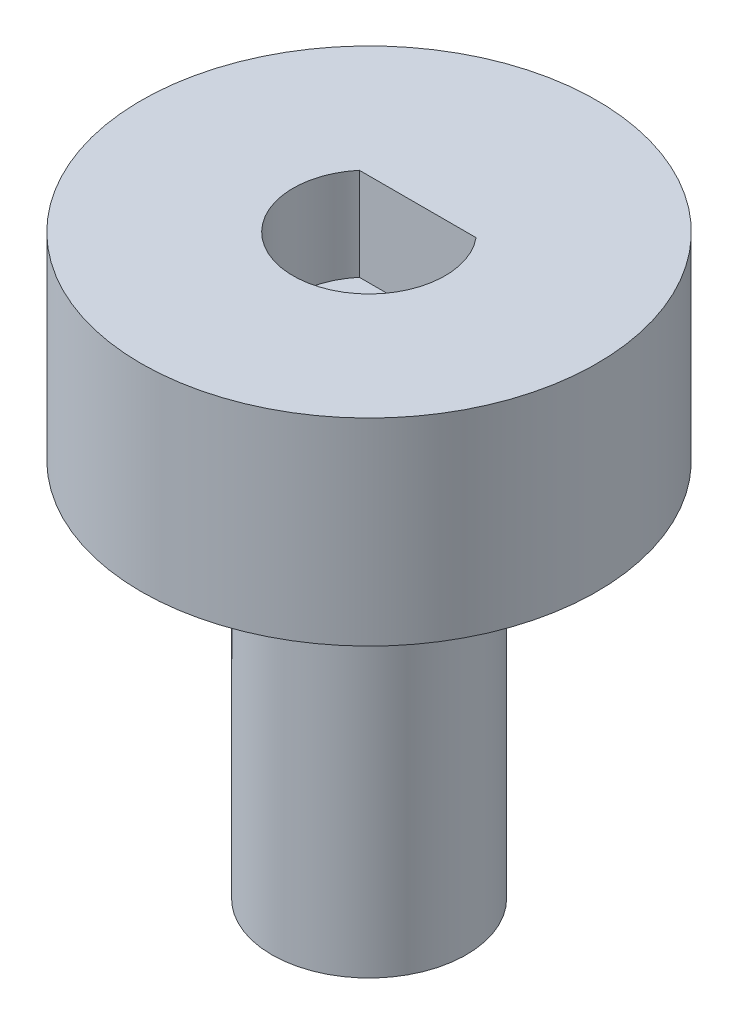
ISO-10303-21;
HEADER;
FILE_DESCRIPTION(('STEP AP214'),'2;1');
FILE_NAME('part.step','',(''),(''),'','','');
FILE_SCHEMA(('AUTOMOTIVE_DESIGN { 1 0 10303 214 1 1 1 1 }'));
ENDSEC;
DATA;
#1=APPLICATION_CONTEXT('core data for automotive mechanical design processes');
#2=APPLICATION_PROTOCOL_DEFINITION('international standard','automotive_design',2000,#1);
#3=PRODUCT_CONTEXT('',#1,'mechanical');
#4=PRODUCT('Part','Part','',(#3));
#5=PRODUCT_RELATED_PRODUCT_CATEGORY('part','',(#4));
#6=PRODUCT_DEFINITION_FORMATION('','',#4);
#7=PRODUCT_DEFINITION_CONTEXT('part definition',#1,'design');
#8=PRODUCT_DEFINITION('design','',#6,#7);
#9=PRODUCT_DEFINITION_SHAPE('','',#8);
#10=(LENGTH_UNIT() NAMED_UNIT(*) SI_UNIT(.MILLI.,.METRE.));
#11=(NAMED_UNIT(*) PLANE_ANGLE_UNIT() SI_UNIT($,.RADIAN.));
#12=(NAMED_UNIT(*) SI_UNIT($,.STERADIAN.) SOLID_ANGLE_UNIT());
#13=UNCERTAINTY_MEASURE_WITH_UNIT(LENGTH_MEASURE(1.E-05),#10,'distance_accuracy_value','');
#14=(GEOMETRIC_REPRESENTATION_CONTEXT(3) GLOBAL_UNCERTAINTY_ASSIGNED_CONTEXT((#13)) GLOBAL_UNIT_ASSIGNED_CONTEXT((#10,
#11,#12)) REPRESENTATION_CONTEXT('',''));
#15=CARTESIAN_POINT('',(0.,0.,0.));
#16=DIRECTION('',(0.,0.,1.));
#17=DIRECTION('',(1.,0.,0.));
#18=AXIS2_PLACEMENT_3D('',#15,#16,#17);
#19=CARTESIAN_POINT('',(0.,15.875,0.));
#20=DIRECTION('',(0.,-1.,0.));
#21=DIRECTION('',(0.,0.,-1.));
#22=AXIS2_PLACEMENT_3D('',#19,#20,#21);
#23=CYLINDRICAL_SURFACE('',#22,4.066);
#24=CARTESIAN_POINT('',(0.,15.875,0.));
#25=DIRECTION('',(0.,1.,0.));
#26=DIRECTION('',(0.,0.,1.));
#27=AXIS2_PLACEMENT_3D('',#24,#25,#26);
#28=CIRCLE('',#27,4.066);
#29=CARTESIAN_POINT('',(0.,15.875,4.066));
#30=VERTEX_POINT('',#29);
#31=EDGE_CURVE('E11',#30,#30,#28,.T.);
#32=ORIENTED_EDGE('',*,*,#31,.F.);
#33=EDGE_LOOP('',(#32));
#34=FACE_BOUND('',#33,.T.);
#35=CARTESIAN_POINT('',(0.,0.,0.));
#36=DIRECTION('',(0.,1.,0.));
#37=DIRECTION('',(0.,0.,1.));
#38=AXIS2_PLACEMENT_3D('',#35,#36,#37);
#39=CIRCLE('',#38,4.066);
#40=CARTESIAN_POINT('',(0.,0.,4.066));
#41=VERTEX_POINT('',#40);
#42=EDGE_CURVE('E36',#41,#41,#39,.T.);
#43=ORIENTED_EDGE('',*,*,#42,.T.);
#44=EDGE_LOOP('',(#43));
#45=FACE_BOUND('',#44,.T.);
#46=ADVANCED_FACE('F33',(#34,#45),#23,.T.);
#47=CARTESIAN_POINT('',(0.,0.,0.));
#48=DIRECTION('',(0.,1.,0.));
#49=DIRECTION('',(0.,0.,1.));
#50=AXIS2_PLACEMENT_3D('',#47,#48,#49);
#51=PLANE('',#50);
#52=ORIENTED_EDGE('',*,*,#42,.F.);
#53=EDGE_LOOP('',(#52));
#54=FACE_BOUND('',#53,.T.);
#55=ADVANCED_FACE('F99',(#54),#51,.F.);
#56=CARTESIAN_POINT('',(0.,24.13,0.));
#57=DIRECTION('',(0.,-1.,0.));
#58=DIRECTION('',(0.,0.,-1.));
#59=AXIS2_PLACEMENT_3D('',#56,#57,#58);
#60=CYLINDRICAL_SURFACE('',#59,9.525);
#61=CARTESIAN_POINT('',(0.,24.13,0.));
#62=DIRECTION('',(0.,1.,0.));
#63=DIRECTION('',(0.,0.,1.));
#64=AXIS2_PLACEMENT_3D('',#61,#62,#63);
#65=CIRCLE('',#64,9.525);
#66=CARTESIAN_POINT('',(0.,24.13,9.525));
#67=VERTEX_POINT('',#66);
#68=EDGE_CURVE('E79',#67,#67,#65,.T.);
#69=ORIENTED_EDGE('',*,*,#68,.F.);
#70=EDGE_LOOP('',(#69));
#71=FACE_BOUND('',#70,.T.);
#72=CARTESIAN_POINT('',(0.,15.875,0.));
#73=DIRECTION('',(0.,1.,0.));
#74=DIRECTION('',(0.,0.,1.));
#75=AXIS2_PLACEMENT_3D('',#72,#73,#74);
#76=CIRCLE('',#75,9.525);
#77=CARTESIAN_POINT('',(0.,15.875,9.525));
#78=VERTEX_POINT('',#77);
#79=EDGE_CURVE('E63',#78,#78,#76,.T.);
#80=ORIENTED_EDGE('',*,*,#79,.T.);
#81=EDGE_LOOP('',(#80));
#82=FACE_BOUND('',#81,.T.);
#83=ADVANCED_FACE('F85',(#71,#82),#60,.T.);
#84=CARTESIAN_POINT('',(0.,24.13,0.));
#85=DIRECTION('',(0.,1.,0.));
#86=DIRECTION('',(0.,0.,1.));
#87=AXIS2_PLACEMENT_3D('',#84,#85,#86);
#88=PLANE('',#87);
#89=CARTESIAN_POINT('',(0.,24.13,0.));
#90=DIRECTION('',(0.,1.,0.));
#91=DIRECTION('',(0.,0.,1.));
#92=AXIS2_PLACEMENT_3D('',#89,#90,#91);
#93=CIRCLE('',#92,3.175);
#94=CARTESIAN_POINT('',(-2.43959033446192,24.13,-2.032));
#95=VERTEX_POINT('',#94);
#96=CARTESIAN_POINT('',(2.43959033446192,24.13,-2.032));
#97=VERTEX_POINT('',#96);
#98=EDGE_CURVE('E47',#95,#97,#93,.T.);
#99=ORIENTED_EDGE('',*,*,#98,.F.);
#100=DIRECTION('',(-1.,0.,0.));
#101=VECTOR('',#100,1.);
#102=CARTESIAN_POINT('',(-2.43959033446192,24.13,-2.032));
#103=LINE('',#102,#101);
#104=EDGE_CURVE('E67',#97,#95,#103,.T.);
#105=ORIENTED_EDGE('',*,*,#104,.F.);
#106=EDGE_LOOP('',(#99,#105));
#107=FACE_BOUND('',#106,.T.);
#108=ORIENTED_EDGE('',*,*,#68,.T.);
#109=EDGE_LOOP('',(#108));
#110=FACE_BOUND('',#109,.T.);
#111=ADVANCED_FACE('F71',(#107,#110),#88,.T.);
#112=CARTESIAN_POINT('',(0.,15.875,0.));
#113=DIRECTION('',(0.,1.,0.));
#114=DIRECTION('',(0.,0.,1.));
#115=AXIS2_PLACEMENT_3D('',#112,#113,#114);
#116=PLANE('',#115);
#117=ORIENTED_EDGE('',*,*,#31,.T.);
#118=EDGE_LOOP('',(#117));
#119=FACE_BOUND('',#118,.T.);
#120=ORIENTED_EDGE('',*,*,#79,.F.);
#121=EDGE_LOOP('',(#120));
#122=FACE_BOUND('',#121,.T.);
#123=ADVANCED_FACE('F87',(#119,#122),#116,.F.);
#124=CARTESIAN_POINT('',(0.,20.255,0.));
#125=DIRECTION('',(0.,1.,0.));
#126=DIRECTION('',(0.,0.,1.));
#127=AXIS2_PLACEMENT_3D('',#124,#125,#126);
#128=CYLINDRICAL_SURFACE('',#127,3.175);
#129=ORIENTED_EDGE('',*,*,#98,.T.);
#130=DIRECTION('',(0.,1.,0.));
#131=VECTOR('',#130,1.);
#132=CARTESIAN_POINT('',(2.43959033446192,20.255,-2.032));
#133=LINE('',#132,#131);
#134=CARTESIAN_POINT('',(2.43959033446192,20.255,-2.032));
#135=VERTEX_POINT('',#134);
#136=EDGE_CURVE('E64',#135,#97,#133,.T.);
#137=ORIENTED_EDGE('',*,*,#136,.F.);
#138=CARTESIAN_POINT('',(0.,20.255,0.));
#139=DIRECTION('',(0.,1.,0.));
#140=DIRECTION('',(0.,0.,1.));
#141=AXIS2_PLACEMENT_3D('',#138,#139,#140);
#142=CIRCLE('',#141,3.175);
#143=CARTESIAN_POINT('',(-2.43959033446192,20.255,-2.032));
#144=VERTEX_POINT('',#143);
#145=EDGE_CURVE('E61',#144,#135,#142,.T.);
#146=ORIENTED_EDGE('',*,*,#145,.F.);
#147=DIRECTION('',(0.,1.,0.));
#148=VECTOR('',#147,1.);
#149=CARTESIAN_POINT('',(-2.43959033446192,20.255,-2.032));
#150=LINE('',#149,#148);
#151=EDGE_CURVE('E55',#144,#95,#150,.T.);
#152=ORIENTED_EDGE('',*,*,#151,.T.);
#153=EDGE_LOOP('',(#129,#137,#146,#152));
#154=FACE_BOUND('',#153,.T.);
#155=ADVANCED_FACE('F59',(#154),#128,.F.);
#156=CARTESIAN_POINT('',(-2.43959033446192,20.255,-2.032));
#157=DIRECTION('',(0.,0.,-1.));
#158=DIRECTION('',(-1.,0.,0.));
#159=AXIS2_PLACEMENT_3D('',#156,#157,#158);
#160=PLANE('',#159);
#161=ORIENTED_EDGE('',*,*,#104,.T.);
#162=ORIENTED_EDGE('',*,*,#151,.F.);
#163=DIRECTION('',(-1.,0.,0.));
#164=VECTOR('',#163,1.);
#165=CARTESIAN_POINT('',(-2.43959033446192,20.255,-2.032));
#166=LINE('',#165,#164);
#167=EDGE_CURVE('E75',#135,#144,#166,.T.);
#168=ORIENTED_EDGE('',*,*,#167,.F.);
#169=ORIENTED_EDGE('',*,*,#136,.T.);
#170=EDGE_LOOP('',(#161,#162,#168,#169));
#171=FACE_BOUND('',#170,.T.);
#172=ADVANCED_FACE('F68',(#171),#160,.F.);
#173=CARTESIAN_POINT('',(0.,20.255,0.));
#174=DIRECTION('',(0.,1.,0.));
#175=DIRECTION('',(0.,0.,1.));
#176=AXIS2_PLACEMENT_3D('',#173,#174,#175);
#177=PLANE('',#176);
#178=ORIENTED_EDGE('',*,*,#145,.T.);
#179=ORIENTED_EDGE('',*,*,#167,.T.);
#180=EDGE_LOOP('',(#178,#179));
#181=FACE_BOUND('',#180,.T.);
#182=ADVANCED_FACE('F137',(#181),#177,.T.);
#183=CLOSED_SHELL('',(#46,#55,#83,#111,#123,#155,#172,#182));
#184=MANIFOLD_SOLID_BREP('B2',#183);
#185=ADVANCED_BREP_SHAPE_REPRESENTATION('',(#18,#184),#14);
#186=SHAPE_DEFINITION_REPRESENTATION(#9,#185);
ENDSEC;
END-ISO-10303-21;
